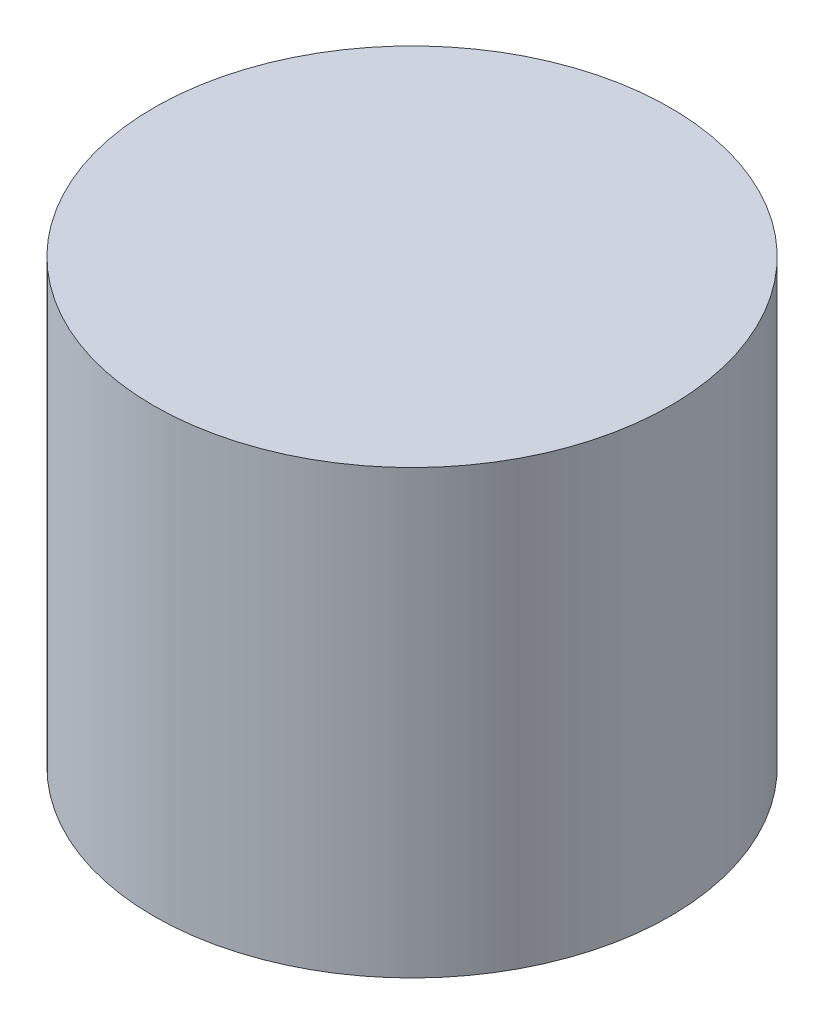
ISO-10303-21;
HEADER;
FILE_DESCRIPTION(('STEP AP214'),'2;1');
FILE_NAME('part.step','',(''),(''),'','','');
FILE_SCHEMA(('AUTOMOTIVE_DESIGN { 1 0 10303 214 1 1 1 1 }'));
ENDSEC;
DATA;
#1=APPLICATION_CONTEXT('core data for automotive mechanical design processes');
#2=APPLICATION_PROTOCOL_DEFINITION('international standard','automotive_design',2000,#1);
#3=PRODUCT_CONTEXT('',#1,'mechanical');
#4=PRODUCT('Part','Part','',(#3));
#5=PRODUCT_RELATED_PRODUCT_CATEGORY('part','',(#4));
#6=PRODUCT_DEFINITION_FORMATION('','',#4);
#7=PRODUCT_DEFINITION_CONTEXT('part definition',#1,'design');
#8=PRODUCT_DEFINITION('design','',#6,#7);
#9=PRODUCT_DEFINITION_SHAPE('','',#8);
#10=(LENGTH_UNIT() NAMED_UNIT(*) SI_UNIT(.MILLI.,.METRE.));
#11=(NAMED_UNIT(*) PLANE_ANGLE_UNIT() SI_UNIT($,.RADIAN.));
#12=(NAMED_UNIT(*) SI_UNIT($,.STERADIAN.) SOLID_ANGLE_UNIT());
#13=UNCERTAINTY_MEASURE_WITH_UNIT(LENGTH_MEASURE(1.E-05),#10,'distance_accuracy_value','');
#14=(GEOMETRIC_REPRESENTATION_CONTEXT(3) GLOBAL_UNCERTAINTY_ASSIGNED_CONTEXT((#13)) GLOBAL_UNIT_ASSIGNED_CONTEXT((#10,
#11,#12)) REPRESENTATION_CONTEXT('',''));
#15=CARTESIAN_POINT('',(0.,0.,0.));
#16=DIRECTION('',(0.,0.,1.));
#17=DIRECTION('',(1.,0.,0.));
#18=AXIS2_PLACEMENT_3D('',#15,#16,#17);
#19=CARTESIAN_POINT('',(0.,21.4,0.));
#20=DIRECTION('',(0.,-1.,0.));
#21=DIRECTION('',(0.,0.,-1.));
#22=AXIS2_PLACEMENT_3D('',#19,#20,#21);
#23=CYLINDRICAL_SURFACE('',#22,12.5);
#24=CARTESIAN_POINT('',(0.,21.4,0.));
#25=DIRECTION('',(0.,1.,0.));
#26=DIRECTION('',(0.,0.,1.));
#27=AXIS2_PLACEMENT_3D('',#24,#25,#26);
#28=CIRCLE('',#27,12.5);
#29=CARTESIAN_POINT('',(0.,21.4,12.5));
#30=VERTEX_POINT('',#29);
#31=EDGE_CURVE('E10',#30,#30,#28,.T.);
#32=ORIENTED_EDGE('',*,*,#31,.F.);
#33=EDGE_LOOP('',(#32));
#34=FACE_BOUND('',#33,.T.);
#35=CARTESIAN_POINT('',(0.,0.,0.));
#36=DIRECTION('',(0.,1.,0.));
#37=DIRECTION('',(0.,0.,1.));
#38=AXIS2_PLACEMENT_3D('',#35,#36,#37);
#39=CIRCLE('',#38,12.5);
#40=CARTESIAN_POINT('',(0.,0.,12.5));
#41=VERTEX_POINT('',#40);
#42=EDGE_CURVE('E40',#41,#41,#39,.T.);
#43=ORIENTED_EDGE('',*,*,#42,.T.);
#44=EDGE_LOOP('',(#43));
#45=FACE_BOUND('',#44,.T.);
#46=ADVANCED_FACE('F37',(#34,#45),#23,.T.);
#47=CARTESIAN_POINT('',(0.,21.4,0.));
#48=DIRECTION('',(0.,1.,0.));
#49=DIRECTION('',(0.,0.,1.));
#50=AXIS2_PLACEMENT_3D('',#47,#48,#49);
#51=PLANE('',#50);
#52=ORIENTED_EDGE('',*,*,#31,.T.);
#53=EDGE_LOOP('',(#52));
#54=FACE_BOUND('',#53,.T.);
#55=ADVANCED_FACE('F54',(#54),#51,.T.);
#56=CARTESIAN_POINT('',(0.,0.,0.));
#57=DIRECTION('',(0.,1.,0.));
#58=DIRECTION('',(0.,0.,1.));
#59=AXIS2_PLACEMENT_3D('',#56,#57,#58);
#60=PLANE('',#59);
#61=ORIENTED_EDGE('',*,*,#42,.F.);
#62=EDGE_LOOP('',(#61));
#63=FACE_BOUND('',#62,.T.);
#64=ADVANCED_FACE('F52',(#63),#60,.F.);
#65=CLOSED_SHELL('',(#46,#55,#64));
#66=MANIFOLD_SOLID_BREP('B2',#65);
#67=ADVANCED_BREP_SHAPE_REPRESENTATION('',(#18,#66),#14);
#68=SHAPE_DEFINITION_REPRESENTATION(#9,#67);
ENDSEC;
END-ISO-10303-21;
